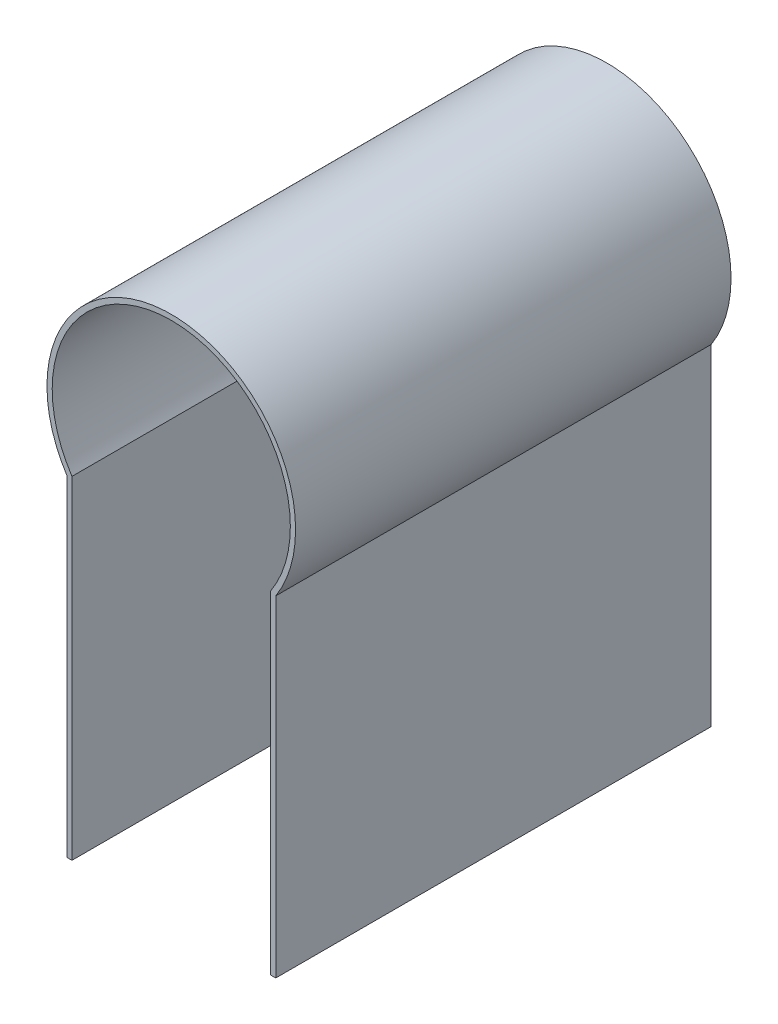
ISO-10303-21;
HEADER;
FILE_DESCRIPTION(('STEP AP214'),'2;1');
FILE_NAME('part.step','',(''),(''),'','','');
FILE_SCHEMA(('AUTOMOTIVE_DESIGN { 1 0 10303 214 1 1 1 1 }'));
ENDSEC;
DATA;
#1=APPLICATION_CONTEXT('core data for automotive mechanical design processes');
#2=APPLICATION_PROTOCOL_DEFINITION('international standard','automotive_design',2000,#1);
#3=PRODUCT_CONTEXT('',#1,'mechanical');
#4=PRODUCT('Part','Part','',(#3));
#5=PRODUCT_RELATED_PRODUCT_CATEGORY('part','',(#4));
#6=PRODUCT_DEFINITION_FORMATION('','',#4);
#7=PRODUCT_DEFINITION_CONTEXT('part definition',#1,'design');
#8=PRODUCT_DEFINITION('design','',#6,#7);
#9=PRODUCT_DEFINITION_SHAPE('','',#8);
#10=(LENGTH_UNIT() NAMED_UNIT(*) SI_UNIT(.MILLI.,.METRE.));
#11=(NAMED_UNIT(*) PLANE_ANGLE_UNIT() SI_UNIT($,.RADIAN.));
#12=(NAMED_UNIT(*) SI_UNIT($,.STERADIAN.) SOLID_ANGLE_UNIT());
#13=UNCERTAINTY_MEASURE_WITH_UNIT(LENGTH_MEASURE(1.E-05),#10,'distance_accuracy_value','');
#14=(GEOMETRIC_REPRESENTATION_CONTEXT(3) GLOBAL_UNCERTAINTY_ASSIGNED_CONTEXT((#13)) GLOBAL_UNIT_ASSIGNED_CONTEXT((#10,
#11,#12)) REPRESENTATION_CONTEXT('',''));
#15=CARTESIAN_POINT('',(0.,0.,0.));
#16=DIRECTION('',(0.,0.,1.));
#17=DIRECTION('',(1.,0.,0.));
#18=AXIS2_PLACEMENT_3D('',#15,#16,#17);
#19=CARTESIAN_POINT('',(57.,0.,250.));
#20=DIRECTION('',(0.,1.,0.));
#21=DIRECTION('',(0.,0.,1.));
#22=AXIS2_PLACEMENT_3D('',#19,#20,#21);
#23=PLANE('',#22);
#24=DIRECTION('',(1.,0.,0.));
#25=VECTOR('',#24,1.);
#26=CARTESIAN_POINT('',(57.,0.,0.));
#27=LINE('',#26,#25);
#28=CARTESIAN_POINT('',(57.,0.,0.));
#29=VERTEX_POINT('',#28);
#30=CARTESIAN_POINT('',(60.,0.,0.));
#31=VERTEX_POINT('',#30);
#32=EDGE_CURVE('E129',#29,#31,#27,.T.);
#33=ORIENTED_EDGE('',*,*,#32,.T.);
#34=DIRECTION('',(0.,0.,-1.));
#35=VECTOR('',#34,1.);
#36=CARTESIAN_POINT('',(60.,0.,250.));
#37=LINE('',#36,#35);
#38=CARTESIAN_POINT('',(60.,0.,250.));
#39=VERTEX_POINT('',#38);
#40=EDGE_CURVE('E11',#39,#31,#37,.T.);
#41=ORIENTED_EDGE('',*,*,#40,.F.);
#42=DIRECTION('',(1.,0.,0.));
#43=VECTOR('',#42,1.);
#44=CARTESIAN_POINT('',(57.,0.,250.));
#45=LINE('',#44,#43);
#46=CARTESIAN_POINT('',(57.,0.,250.));
#47=VERTEX_POINT('',#46);
#48=EDGE_CURVE('E143',#47,#39,#45,.T.);
#49=ORIENTED_EDGE('',*,*,#48,.F.);
#50=DIRECTION('',(0.,0.,-1.));
#51=VECTOR('',#50,1.);
#52=CARTESIAN_POINT('',(57.,0.,250.));
#53=LINE('',#52,#51);
#54=EDGE_CURVE('E125',#47,#29,#53,.T.);
#55=ORIENTED_EDGE('',*,*,#54,.T.);
#56=EDGE_LOOP('',(#33,#41,#49,#55));
#57=FACE_BOUND('',#56,.T.);
#58=ADVANCED_FACE('F33',(#57),#23,.F.);
#59=CARTESIAN_POINT('',(60.,0.,250.));
#60=DIRECTION('',(-1.,0.,0.));
#61=DIRECTION('',(0.,0.,1.));
#62=AXIS2_PLACEMENT_3D('',#59,#60,#61);
#63=PLANE('',#62);
#64=DIRECTION('',(0.,1.,0.));
#65=VECTOR('',#64,1.);
#66=CARTESIAN_POINT('',(60.,0.,0.));
#67=LINE('',#66,#65);
#68=CARTESIAN_POINT('',(60.,190.,0.));
#69=VERTEX_POINT('',#68);
#70=EDGE_CURVE('E132',#31,#69,#67,.T.);
#71=ORIENTED_EDGE('',*,*,#70,.T.);
#72=DIRECTION('',(0.,0.,-1.));
#73=VECTOR('',#72,1.);
#74=CARTESIAN_POINT('',(60.,190.,250.));
#75=LINE('',#74,#73);
#76=CARTESIAN_POINT('',(60.,190.,250.));
#77=VERTEX_POINT('',#76);
#78=EDGE_CURVE('E41',#77,#69,#75,.T.);
#79=ORIENTED_EDGE('',*,*,#78,.F.);
#80=DIRECTION('',(0.,1.,0.));
#81=VECTOR('',#80,1.);
#82=CARTESIAN_POINT('',(60.,0.,250.));
#83=LINE('',#82,#81);
#84=EDGE_CURVE('E92',#39,#77,#83,.T.);
#85=ORIENTED_EDGE('',*,*,#84,.F.);
#86=ORIENTED_EDGE('',*,*,#40,.T.);
#87=EDGE_LOOP('',(#71,#79,#85,#86));
#88=FACE_BOUND('',#87,.T.);
#89=ADVANCED_FACE('F178',(#88),#63,.F.);
#90=CARTESIAN_POINT('',(0.,228.636363636364,250.));
#91=DIRECTION('',(0.,0.,-1.));
#92=DIRECTION('',(-1.,0.,0.));
#93=AXIS2_PLACEMENT_3D('',#90,#91,#92);
#94=CYLINDRICAL_SURFACE('',#93,71.3636363636364);
#95=CARTESIAN_POINT('',(0.,228.636363636364,0.));
#96=DIRECTION('',(0.,0.,1.));
#97=DIRECTION('',(-1.,0.,0.));
#98=AXIS2_PLACEMENT_3D('',#95,#96,#97);
#99=CIRCLE('',#98,71.3636363636364);
#100=CARTESIAN_POINT('',(-60.,190.,0.));
#101=VERTEX_POINT('',#100);
#102=EDGE_CURVE('E134',#69,#101,#99,.T.);
#103=ORIENTED_EDGE('',*,*,#102,.T.);
#104=DIRECTION('',(0.,0.,-1.));
#105=VECTOR('',#104,1.);
#106=CARTESIAN_POINT('',(-60.,190.,250.));
#107=LINE('',#106,#105);
#108=CARTESIAN_POINT('',(-60.,190.,250.));
#109=VERTEX_POINT('',#108);
#110=EDGE_CURVE('E150',#109,#101,#107,.T.);
#111=ORIENTED_EDGE('',*,*,#110,.F.);
#112=CARTESIAN_POINT('',(0.,228.636363636364,250.));
#113=DIRECTION('',(0.,0.,1.));
#114=DIRECTION('',(-1.,0.,0.));
#115=AXIS2_PLACEMENT_3D('',#112,#113,#114);
#116=CIRCLE('',#115,71.3636363636364);
#117=EDGE_CURVE('E158',#77,#109,#116,.T.);
#118=ORIENTED_EDGE('',*,*,#117,.F.);
#119=ORIENTED_EDGE('',*,*,#78,.T.);
#120=EDGE_LOOP('',(#103,#111,#118,#119));
#121=FACE_BOUND('',#120,.T.);
#122=ADVANCED_FACE('F156',(#121),#94,.T.);
#123=CARTESIAN_POINT('',(-60.,0.,250.));
#124=DIRECTION('',(1.,0.,0.));
#125=DIRECTION('',(0.,0.,-1.));
#126=AXIS2_PLACEMENT_3D('',#123,#124,#125);
#127=PLANE('',#126);
#128=DIRECTION('',(0.,-1.,0.));
#129=VECTOR('',#128,1.);
#130=CARTESIAN_POINT('',(-60.,0.,0.));
#131=LINE('',#130,#129);
#132=CARTESIAN_POINT('',(-60.,0.,0.));
#133=VERTEX_POINT('',#132);
#134=EDGE_CURVE('E136',#101,#133,#131,.T.);
#135=ORIENTED_EDGE('',*,*,#134,.T.);
#136=DIRECTION('',(0.,0.,-1.));
#137=VECTOR('',#136,1.);
#138=CARTESIAN_POINT('',(-60.,0.,250.));
#139=LINE('',#138,#137);
#140=CARTESIAN_POINT('',(-60.,0.,250.));
#141=VERTEX_POINT('',#140);
#142=EDGE_CURVE('E147',#141,#133,#139,.T.);
#143=ORIENTED_EDGE('',*,*,#142,.F.);
#144=DIRECTION('',(0.,-1.,0.));
#145=VECTOR('',#144,1.);
#146=CARTESIAN_POINT('',(-60.,0.,250.));
#147=LINE('',#146,#145);
#148=EDGE_CURVE('E170',#109,#141,#147,.T.);
#149=ORIENTED_EDGE('',*,*,#148,.F.);
#150=ORIENTED_EDGE('',*,*,#110,.T.);
#151=EDGE_LOOP('',(#135,#143,#149,#150));
#152=FACE_BOUND('',#151,.T.);
#153=ADVANCED_FACE('F166',(#152),#127,.F.);
#154=CARTESIAN_POINT('',(-60.,0.,250.));
#155=DIRECTION('',(0.,1.,0.));
#156=DIRECTION('',(0.,0.,1.));
#157=AXIS2_PLACEMENT_3D('',#154,#155,#156);
#158=PLANE('',#157);
#159=DIRECTION('',(1.,0.,0.));
#160=VECTOR('',#159,1.);
#161=CARTESIAN_POINT('',(-60.,0.,0.));
#162=LINE('',#161,#160);
#163=CARTESIAN_POINT('',(-57.,0.,0.));
#164=VERTEX_POINT('',#163);
#165=EDGE_CURVE('E138',#133,#164,#162,.T.);
#166=ORIENTED_EDGE('',*,*,#165,.T.);
#167=DIRECTION('',(0.,0.,-1.));
#168=VECTOR('',#167,1.);
#169=CARTESIAN_POINT('',(-57.,0.,250.));
#170=LINE('',#169,#168);
#171=CARTESIAN_POINT('',(-57.,0.,250.));
#172=VERTEX_POINT('',#171);
#173=EDGE_CURVE('E120',#172,#164,#170,.T.);
#174=ORIENTED_EDGE('',*,*,#173,.F.);
#175=DIRECTION('',(1.,0.,0.));
#176=VECTOR('',#175,1.);
#177=CARTESIAN_POINT('',(-60.,0.,250.));
#178=LINE('',#177,#176);
#179=EDGE_CURVE('E111',#141,#172,#178,.T.);
#180=ORIENTED_EDGE('',*,*,#179,.F.);
#181=ORIENTED_EDGE('',*,*,#142,.T.);
#182=EDGE_LOOP('',(#166,#174,#180,#181));
#183=FACE_BOUND('',#182,.T.);
#184=ADVANCED_FACE('F169',(#183),#158,.F.);
#185=CARTESIAN_POINT('',(-57.,0.,250.));
#186=DIRECTION('',(-1.,0.,0.));
#187=DIRECTION('',(0.,0.,1.));
#188=AXIS2_PLACEMENT_3D('',#185,#186,#187);
#189=PLANE('',#188);
#190=DIRECTION('',(0.,1.,0.));
#191=VECTOR('',#190,1.);
#192=CARTESIAN_POINT('',(-57.,0.,0.));
#193=LINE('',#192,#191);
#194=CARTESIAN_POINT('',(-57.,190.892665131057,0.));
#195=VERTEX_POINT('',#194);
#196=EDGE_CURVE('E119',#164,#195,#193,.T.);
#197=ORIENTED_EDGE('',*,*,#196,.T.);
#198=DIRECTION('',(0.,0.,-1.));
#199=VECTOR('',#198,1.);
#200=CARTESIAN_POINT('',(-57.,190.892665131057,250.));
#201=LINE('',#200,#199);
#202=CARTESIAN_POINT('',(-57.,190.892665131057,250.));
#203=VERTEX_POINT('',#202);
#204=EDGE_CURVE('E116',#203,#195,#201,.T.);
#205=ORIENTED_EDGE('',*,*,#204,.F.);
#206=DIRECTION('',(0.,1.,0.));
#207=VECTOR('',#206,1.);
#208=CARTESIAN_POINT('',(-57.,0.,250.));
#209=LINE('',#208,#207);
#210=EDGE_CURVE('E105',#172,#203,#209,.T.);
#211=ORIENTED_EDGE('',*,*,#210,.F.);
#212=ORIENTED_EDGE('',*,*,#173,.T.);
#213=EDGE_LOOP('',(#197,#205,#211,#212));
#214=FACE_BOUND('',#213,.T.);
#215=ADVANCED_FACE('F117',(#214),#189,.F.);
#216=CARTESIAN_POINT('',(0.,228.636363636364,250.));
#217=DIRECTION('',(0.,0.,-1.));
#218=DIRECTION('',(-1.,0.,0.));
#219=AXIS2_PLACEMENT_3D('',#216,#217,#218);
#220=CYLINDRICAL_SURFACE('',#219,68.3636363636364);
#221=CARTESIAN_POINT('',(0.,228.636363636364,0.));
#222=DIRECTION('',(0.,0.,-1.));
#223=DIRECTION('',(-1.,0.,0.));
#224=AXIS2_PLACEMENT_3D('',#221,#222,#223);
#225=CIRCLE('',#224,68.3636363636364);
#226=CARTESIAN_POINT('',(57.,190.892665131057,0.));
#227=VERTEX_POINT('',#226);
#228=EDGE_CURVE('E78',#195,#227,#225,.T.);
#229=ORIENTED_EDGE('',*,*,#228,.T.);
#230=DIRECTION('',(0.,0.,-1.));
#231=VECTOR('',#230,1.);
#232=CARTESIAN_POINT('',(57.,190.892665131057,250.));
#233=LINE('',#232,#231);
#234=CARTESIAN_POINT('',(57.,190.892665131057,250.));
#235=VERTEX_POINT('',#234);
#236=EDGE_CURVE('E121',#235,#227,#233,.T.);
#237=ORIENTED_EDGE('',*,*,#236,.F.);
#238=CARTESIAN_POINT('',(0.,228.636363636364,250.));
#239=DIRECTION('',(0.,0.,-1.));
#240=DIRECTION('',(-1.,0.,0.));
#241=AXIS2_PLACEMENT_3D('',#238,#239,#240);
#242=CIRCLE('',#241,68.3636363636364);
#243=EDGE_CURVE('E109',#203,#235,#242,.T.);
#244=ORIENTED_EDGE('',*,*,#243,.F.);
#245=ORIENTED_EDGE('',*,*,#204,.T.);
#246=EDGE_LOOP('',(#229,#237,#244,#245));
#247=FACE_BOUND('',#246,.T.);
#248=ADVANCED_FACE('F123',(#247),#220,.F.);
#249=CARTESIAN_POINT('',(57.,0.,250.));
#250=DIRECTION('',(1.,0.,0.));
#251=DIRECTION('',(0.,0.,-1.));
#252=AXIS2_PLACEMENT_3D('',#249,#250,#251);
#253=PLANE('',#252);
#254=DIRECTION('',(0.,-1.,0.));
#255=VECTOR('',#254,1.);
#256=CARTESIAN_POINT('',(57.,0.,0.));
#257=LINE('',#256,#255);
#258=EDGE_CURVE('E84',#227,#29,#257,.T.);
#259=ORIENTED_EDGE('',*,*,#258,.T.);
#260=ORIENTED_EDGE('',*,*,#54,.F.);
#261=DIRECTION('',(0.,-1.,0.));
#262=VECTOR('',#261,1.);
#263=CARTESIAN_POINT('',(57.,0.,250.));
#264=LINE('',#263,#262);
#265=EDGE_CURVE('E49',#235,#47,#264,.T.);
#266=ORIENTED_EDGE('',*,*,#265,.F.);
#267=ORIENTED_EDGE('',*,*,#236,.T.);
#268=EDGE_LOOP('',(#259,#260,#266,#267));
#269=FACE_BOUND('',#268,.T.);
#270=ADVANCED_FACE('F194',(#269),#253,.F.);
#271=CARTESIAN_POINT('',(0.,228.636363636364,250.));
#272=DIRECTION('',(0.,0.,-1.));
#273=DIRECTION('',(-1.,0.,0.));
#274=AXIS2_PLACEMENT_3D('',#271,#272,#273);
#275=PLANE('',#274);
#276=ORIENTED_EDGE('',*,*,#48,.T.);
#277=ORIENTED_EDGE('',*,*,#84,.T.);
#278=ORIENTED_EDGE('',*,*,#117,.T.);
#279=ORIENTED_EDGE('',*,*,#148,.T.);
#280=ORIENTED_EDGE('',*,*,#179,.T.);
#281=ORIENTED_EDGE('',*,*,#210,.T.);
#282=ORIENTED_EDGE('',*,*,#243,.T.);
#283=ORIENTED_EDGE('',*,*,#265,.T.);
#284=EDGE_LOOP('',(#276,#277,#278,#279,#280,#281,#282,#283));
#285=FACE_BOUND('',#284,.T.);
#286=ADVANCED_FACE('F107',(#285),#275,.F.);
#287=CARTESIAN_POINT('',(0.,228.636363636364,0.));
#288=DIRECTION('',(0.,0.,-1.));
#289=DIRECTION('',(-1.,0.,0.));
#290=AXIS2_PLACEMENT_3D('',#287,#288,#289);
#291=PLANE('',#290);
#292=ORIENTED_EDGE('',*,*,#32,.F.);
#293=ORIENTED_EDGE('',*,*,#258,.F.);
#294=ORIENTED_EDGE('',*,*,#228,.F.);
#295=ORIENTED_EDGE('',*,*,#196,.F.);
#296=ORIENTED_EDGE('',*,*,#165,.F.);
#297=ORIENTED_EDGE('',*,*,#134,.F.);
#298=ORIENTED_EDGE('',*,*,#102,.F.);
#299=ORIENTED_EDGE('',*,*,#70,.F.);
#300=EDGE_LOOP('',(#292,#293,#294,#295,#296,#297,#298,#299));
#301=FACE_BOUND('',#300,.T.);
#302=ADVANCED_FACE('F162',(#301),#291,.T.);
#303=CLOSED_SHELL('',(#58,#89,#122,#153,#184,#215,#248,#270,#286,#302));
#304=MANIFOLD_SOLID_BREP('B2',#303);
#305=ADVANCED_BREP_SHAPE_REPRESENTATION('',(#18,#304),#14);
#306=SHAPE_DEFINITION_REPRESENTATION(#9,#305);
ENDSEC;
END-ISO-10303-21;
